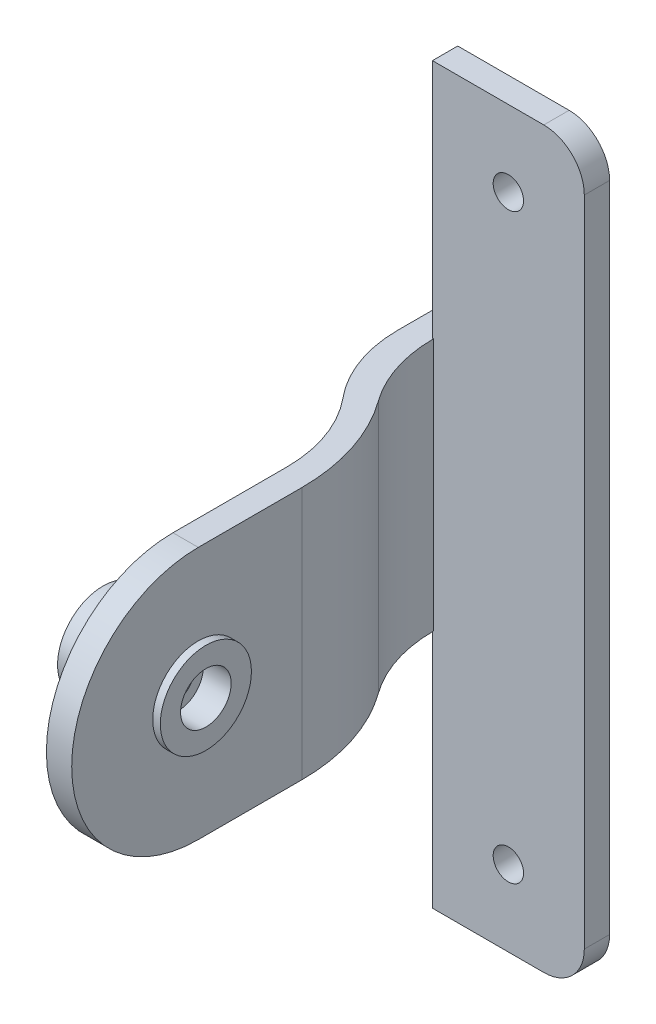
ISO-10303-21;
HEADER;
FILE_DESCRIPTION(('STEP AP214'),'2;1');
FILE_NAME('part.step','',(''),(''),'','','');
FILE_SCHEMA(('AUTOMOTIVE_DESIGN { 1 0 10303 214 1 1 1 1 }'));
ENDSEC;
DATA;
#1=APPLICATION_CONTEXT('core data for automotive mechanical design processes');
#2=APPLICATION_PROTOCOL_DEFINITION('international standard','automotive_design',2000,#1);
#3=PRODUCT_CONTEXT('',#1,'mechanical');
#4=PRODUCT('Part','Part','',(#3));
#5=PRODUCT_RELATED_PRODUCT_CATEGORY('part','',(#4));
#6=PRODUCT_DEFINITION_FORMATION('','',#4);
#7=PRODUCT_DEFINITION_CONTEXT('part definition',#1,'design');
#8=PRODUCT_DEFINITION('design','',#6,#7);
#9=PRODUCT_DEFINITION_SHAPE('','',#8);
#10=(LENGTH_UNIT() NAMED_UNIT(*) SI_UNIT(.MILLI.,.METRE.));
#11=(NAMED_UNIT(*) PLANE_ANGLE_UNIT() SI_UNIT($,.RADIAN.));
#12=(NAMED_UNIT(*) SI_UNIT($,.STERADIAN.) SOLID_ANGLE_UNIT());
#13=UNCERTAINTY_MEASURE_WITH_UNIT(LENGTH_MEASURE(1.E-05),#10,'distance_accuracy_value','');
#14=(GEOMETRIC_REPRESENTATION_CONTEXT(3) GLOBAL_UNCERTAINTY_ASSIGNED_CONTEXT((#13)) GLOBAL_UNIT_ASSIGNED_CONTEXT((#10,
#11,#12)) REPRESENTATION_CONTEXT('',''));
#15=CARTESIAN_POINT('',(0.,0.,0.));
#16=DIRECTION('',(0.,0.,1.));
#17=DIRECTION('',(1.,0.,0.));
#18=AXIS2_PLACEMENT_3D('',#15,#16,#17);
#19=CARTESIAN_POINT('',(-16.5626357879326,-12.5,-10.229605827828));
#20=DIRECTION('',(0.,-1.,0.));
#21=DIRECTION('',(0.,0.,-1.));
#22=AXIS2_PLACEMENT_3D('',#19,#20,#21);
#23=PLANE('',#22);
#24=DIRECTION('',(-1.,0.,0.));
#25=VECTOR('',#24,1.);
#26=CARTESIAN_POINT('',(-6.22117269606802,-12.5,-31.95));
#27=LINE('',#26,#25);
#28=CARTESIAN_POINT('',(-3.82117269606802,-12.5,-31.95));
#29=VERTEX_POINT('',#28);
#30=CARTESIAN_POINT('',(-6.22117269606802,-12.5,-31.95));
#31=VERTEX_POINT('',#30);
#32=EDGE_CURVE('E12',#29,#31,#27,.T.);
#33=ORIENTED_EDGE('',*,*,#32,.F.);
#34=DIRECTION('',(0.,0.,-1.));
#35=VECTOR('',#34,1.);
#36=CARTESIAN_POINT('',(-3.82117269606802,-12.5,-29.45));
#37=LINE('',#36,#35);
#38=CARTESIAN_POINT('',(-3.82117269606802,-12.5,-29.45));
#39=VERTEX_POINT('',#38);
#40=EDGE_CURVE('E220',#39,#29,#37,.T.);
#41=ORIENTED_EDGE('',*,*,#40,.F.);
#42=DIRECTION('',(-1.,0.,0.));
#43=VECTOR('',#42,1.);
#44=CARTESIAN_POINT('',(11.178827303932,-12.5,-29.45));
#45=LINE('',#44,#43);
#46=CARTESIAN_POINT('',(-3.72117269606802,-12.5,-29.45));
#47=VERTEX_POINT('',#46);
#48=EDGE_CURVE('E193',#47,#39,#45,.T.);
#49=ORIENTED_EDGE('',*,*,#48,.F.);
#50=CARTESIAN_POINT('',(10.0176070839933,-12.5,-29.45));
#51=DIRECTION('',(0.,-1.,0.));
#52=DIRECTION('',(0.,0.,1.));
#53=AXIS2_PLACEMENT_3D('',#50,#51,#52);
#54=CIRCLE('',#53,13.7387797800613);
#55=CARTESIAN_POINT('',(-1.1154521756278,-12.5,-21.3995924720058));
#56=VERTEX_POINT('',#55);
#57=EDGE_CURVE('E320',#56,#47,#54,.T.);
#58=ORIENTED_EDGE('',*,*,#57,.F.);
#59=CARTESIAN_POINT('',(-16.5626357879326,-12.5,-10.229605827828));
#60=DIRECTION('',(0.,1.,0.));
#61=DIRECTION('',(0.,0.,-1.));
#62=AXIS2_PLACEMENT_3D('',#59,#60,#61);
#63=CIRCLE('',#62,19.0626357879326);
#64=CARTESIAN_POINT('',(2.5,-12.5,-10.229605827828));
#65=VERTEX_POINT('',#64);
#66=EDGE_CURVE('E317',#65,#56,#63,.T.);
#67=ORIENTED_EDGE('',*,*,#66,.F.);
#68=DIRECTION('',(0.,0.,-1.));
#69=VECTOR('',#68,1.);
#70=CARTESIAN_POINT('',(2.5,-12.5,-7.72960582782795));
#71=LINE('',#70,#69);
#72=CARTESIAN_POINT('',(2.5,-12.5,0.));
#73=VERTEX_POINT('',#72);
#74=EDGE_CURVE('E282',#73,#65,#71,.T.);
#75=ORIENTED_EDGE('',*,*,#74,.F.);
#76=DIRECTION('',(-1.,0.,0.));
#77=VECTOR('',#76,1.);
#78=CARTESIAN_POINT('',(2.5,-12.5,0.));
#79=LINE('',#78,#77);
#80=CARTESIAN_POINT('',(0.,-12.5,0.));
#81=VERTEX_POINT('',#80);
#82=EDGE_CURVE('E252',#73,#81,#79,.T.);
#83=ORIENTED_EDGE('',*,*,#82,.T.);
#84=DIRECTION('',(0.,0.,1.));
#85=VECTOR('',#84,1.);
#86=CARTESIAN_POINT('',(0.,-12.5,-11.229605827828));
#87=LINE('',#86,#85);
#88=CARTESIAN_POINT('',(0.,-12.5,-11.229605827828));
#89=VERTEX_POINT('',#88);
#90=EDGE_CURVE('E293',#89,#81,#87,.T.);
#91=ORIENTED_EDGE('',*,*,#90,.F.);
#92=CARTESIAN_POINT('',(-13.6359802036032,-12.5,-11.229605827828));
#93=DIRECTION('',(0.,-1.,0.));
#94=DIRECTION('',(0.,0.,-1.));
#95=AXIS2_PLACEMENT_3D('',#92,#93,#94);
#96=CIRCLE('',#95,13.6359802036032);
#97=CARTESIAN_POINT('',(-3.1484631025778,-12.5,-19.9446469160133));
#98=VERTEX_POINT('',#97);
#99=EDGE_CURVE('E330',#98,#89,#96,.T.);
#100=ORIENTED_EDGE('',*,*,#99,.F.);
#101=CARTESIAN_POINT('',(7.08671938434082,-12.5,-28.45));
#102=DIRECTION('',(0.,1.,0.));
#103=DIRECTION('',(0.,0.,-1.));
#104=AXIS2_PLACEMENT_3D('',#101,#102,#103);
#105=CIRCLE('',#104,13.3078920804088);
#106=CARTESIAN_POINT('',(-6.22117269606802,-12.5,-28.45));
#107=VERTEX_POINT('',#106);
#108=EDGE_CURVE('E327',#107,#98,#105,.T.);
#109=ORIENTED_EDGE('',*,*,#108,.F.);
#110=DIRECTION('',(0.,0.,1.));
#111=VECTOR('',#110,1.);
#112=CARTESIAN_POINT('',(-6.22117269606802,-12.5,-31.95));
#113=LINE('',#112,#111);
#114=EDGE_CURVE('E323',#31,#107,#113,.T.);
#115=ORIENTED_EDGE('',*,*,#114,.F.);
#116=EDGE_LOOP('',(#33,#41,#49,#58,#67,#75,#83,#91,#100,#109,#115));
#117=FACE_BOUND('',#116,.T.);
#118=ADVANCED_FACE('F45',(#117),#23,.T.);
#119=CARTESIAN_POINT('',(2.5,12.5,-7.72960582782795));
#120=DIRECTION('',(-1.,0.,0.));
#121=DIRECTION('',(0.,0.,1.));
#122=AXIS2_PLACEMENT_3D('',#119,#120,#121);
#123=PLANE('',#122);
#124=ORIENTED_EDGE('',*,*,#74,.T.);
#125=DIRECTION('',(0.,-1.,0.));
#126=VECTOR('',#125,1.);
#127=CARTESIAN_POINT('',(2.5,12.5,-10.229605827828));
#128=LINE('',#127,#126);
#129=CARTESIAN_POINT('',(2.5,12.5,-10.229605827828));
#130=VERTEX_POINT('',#129);
#131=EDGE_CURVE('E49',#130,#65,#128,.T.);
#132=ORIENTED_EDGE('',*,*,#131,.F.);
#133=DIRECTION('',(0.,0.,-1.));
#134=VECTOR('',#133,1.);
#135=CARTESIAN_POINT('',(2.5,12.5,-7.72960582782795));
#136=LINE('',#135,#134);
#137=CARTESIAN_POINT('',(2.5,12.5,0.));
#138=VERTEX_POINT('',#137);
#139=EDGE_CURVE('E289',#138,#130,#136,.T.);
#140=ORIENTED_EDGE('',*,*,#139,.F.);
#141=CARTESIAN_POINT('',(2.5,0.,0.));
#142=DIRECTION('',(1.,0.,0.));
#143=DIRECTION('',(0.,0.,-1.));
#144=AXIS2_PLACEMENT_3D('',#141,#142,#143);
#145=CIRCLE('',#144,12.5);
#146=EDGE_CURVE('E240',#138,#73,#145,.T.);
#147=ORIENTED_EDGE('',*,*,#146,.T.);
#148=EDGE_LOOP('',(#124,#132,#140,#147));
#149=FACE_BOUND('',#148,.T.);
#150=CARTESIAN_POINT('',(2.5,0.,0.));
#151=DIRECTION('',(1.,0.,0.));
#152=DIRECTION('',(0.,0.,-1.));
#153=AXIS2_PLACEMENT_3D('',#150,#151,#152);
#154=CIRCLE('',#153,4.5);
#155=CARTESIAN_POINT('',(2.5,0.,-4.5));
#156=VERTEX_POINT('',#155);
#157=EDGE_CURVE('E278',#156,#156,#154,.T.);
#158=ORIENTED_EDGE('',*,*,#157,.F.);
#159=EDGE_LOOP('',(#158));
#160=FACE_BOUND('',#159,.T.);
#161=ADVANCED_FACE('F47',(#149,#160),#123,.F.);
#162=CARTESIAN_POINT('',(-16.5626357879326,12.5,-10.229605827828));
#163=DIRECTION('',(0.,-1.,0.));
#164=DIRECTION('',(0.,0.,-1.));
#165=AXIS2_PLACEMENT_3D('',#162,#163,#164);
#166=CYLINDRICAL_SURFACE('',#165,19.0626357879326);
#167=ORIENTED_EDGE('',*,*,#66,.T.);
#168=DIRECTION('',(0.,-1.,0.));
#169=VECTOR('',#168,1.);
#170=CARTESIAN_POINT('',(-1.1154521756278,12.5,-21.3995924720058));
#171=LINE('',#170,#169);
#172=CARTESIAN_POINT('',(-1.1154521756278,12.5,-21.3995924720058));
#173=VERTEX_POINT('',#172);
#174=EDGE_CURVE('E353',#173,#56,#171,.T.);
#175=ORIENTED_EDGE('',*,*,#174,.F.);
#176=CARTESIAN_POINT('',(-16.5626357879326,12.5,-10.229605827828));
#177=DIRECTION('',(0.,1.,0.));
#178=DIRECTION('',(0.,0.,-1.));
#179=AXIS2_PLACEMENT_3D('',#176,#177,#178);
#180=CIRCLE('',#179,19.0626357879326);
#181=EDGE_CURVE('E292',#130,#173,#180,.T.);
#182=ORIENTED_EDGE('',*,*,#181,.F.);
#183=ORIENTED_EDGE('',*,*,#131,.T.);
#184=EDGE_LOOP('',(#167,#175,#182,#183));
#185=FACE_BOUND('',#184,.T.);
#186=ADVANCED_FACE('F365',(#185),#166,.T.);
#187=CARTESIAN_POINT('',(10.0176070839933,12.5,-29.45));
#188=DIRECTION('',(0.,-1.,0.));
#189=DIRECTION('',(0.,0.,-1.));
#190=AXIS2_PLACEMENT_3D('',#187,#188,#189);
#191=CYLINDRICAL_SURFACE('',#190,13.7387797800613);
#192=ORIENTED_EDGE('',*,*,#57,.T.);
#193=DIRECTION('',(0.,-1.,0.));
#194=VECTOR('',#193,1.);
#195=CARTESIAN_POINT('',(-3.72117269606802,12.5,-29.45));
#196=LINE('',#195,#194);
#197=CARTESIAN_POINT('',(-3.72117269606802,12.5,-29.45));
#198=VERTEX_POINT('',#197);
#199=EDGE_CURVE('E350',#198,#47,#196,.T.);
#200=ORIENTED_EDGE('',*,*,#199,.F.);
#201=CARTESIAN_POINT('',(10.0176070839933,12.5,-29.45));
#202=DIRECTION('',(0.,-1.,0.));
#203=DIRECTION('',(0.,0.,1.));
#204=AXIS2_PLACEMENT_3D('',#201,#202,#203);
#205=CIRCLE('',#204,13.7387797800613);
#206=EDGE_CURVE('E296',#173,#198,#205,.T.);
#207=ORIENTED_EDGE('',*,*,#206,.F.);
#208=ORIENTED_EDGE('',*,*,#174,.T.);
#209=EDGE_LOOP('',(#192,#200,#207,#208));
#210=FACE_BOUND('',#209,.T.);
#211=ADVANCED_FACE('F376',(#210),#191,.F.);
#212=CARTESIAN_POINT('',(-6.22117269606802,12.5,-31.95));
#213=DIRECTION('',(0.,0.,1.));
#214=DIRECTION('',(1.,0.,0.));
#215=AXIS2_PLACEMENT_3D('',#212,#213,#214);
#216=PLANE('',#215);
#217=CARTESIAN_POINT('',(3.67882730393198,-28.75,-31.95));
#218=DIRECTION('',(0.,0.,1.));
#219=DIRECTION('',(-1.,0.,0.));
#220=AXIS2_PLACEMENT_3D('',#217,#218,#219);
#221=CIRCLE('',#220,1.5);
#222=CARTESIAN_POINT('',(2.17882730393198,-28.75,-31.95));
#223=VERTEX_POINT('',#222);
#224=EDGE_CURVE('E449',#223,#223,#221,.T.);
#225=ORIENTED_EDGE('',*,*,#224,.T.);
#226=EDGE_LOOP('',(#225));
#227=FACE_BOUND('',#226,.T.);
#228=CARTESIAN_POINT('',(3.67882730393198,28.75,-31.95));
#229=DIRECTION('',(0.,0.,-1.));
#230=DIRECTION('',(-1.,0.,0.));
#231=AXIS2_PLACEMENT_3D('',#228,#229,#230);
#232=CIRCLE('',#231,1.5);
#233=CARTESIAN_POINT('',(2.17882730393198,28.75,-31.95));
#234=VERTEX_POINT('',#233);
#235=EDGE_CURVE('E440',#234,#234,#232,.T.);
#236=ORIENTED_EDGE('',*,*,#235,.F.);
#237=EDGE_LOOP('',(#236));
#238=FACE_BOUND('',#237,.T.);
#239=DIRECTION('',(0.,-1.,0.));
#240=VECTOR('',#239,1.);
#241=CARTESIAN_POINT('',(11.178827303932,12.5,-31.95));
#242=LINE('',#241,#240);
#243=CARTESIAN_POINT('',(11.178827303932,32.25,-31.95));
#244=VERTEX_POINT('',#243);
#245=CARTESIAN_POINT('',(11.178827303932,-32.25,-31.95));
#246=VERTEX_POINT('',#245);
#247=EDGE_CURVE('E174',#244,#246,#242,.T.);
#248=ORIENTED_EDGE('',*,*,#247,.T.);
#249=CARTESIAN_POINT('',(7.17882730393198,-32.25,-31.95));
#250=DIRECTION('',(0.,0.,1.));
#251=DIRECTION('',(-1.,0.,0.));
#252=AXIS2_PLACEMENT_3D('',#249,#250,#251);
#253=CIRCLE('',#252,3.99999999999999);
#254=CARTESIAN_POINT('',(7.17882730393199,-36.25,-31.95));
#255=VERTEX_POINT('',#254);
#256=EDGE_CURVE('E190',#255,#246,#253,.T.);
#257=ORIENTED_EDGE('',*,*,#256,.F.);
#258=DIRECTION('',(1.,0.,0.));
#259=VECTOR('',#258,1.);
#260=CARTESIAN_POINT('',(-3.82117269606801,-36.25,-31.95));
#261=LINE('',#260,#259);
#262=CARTESIAN_POINT('',(-3.82117269606801,-36.25,-31.95));
#263=VERTEX_POINT('',#262);
#264=EDGE_CURVE('E417',#263,#255,#261,.T.);
#265=ORIENTED_EDGE('',*,*,#264,.F.);
#266=DIRECTION('',(0.,-1.,0.));
#267=VECTOR('',#266,1.);
#268=CARTESIAN_POINT('',(-3.82117269606802,-12.5,-31.95));
#269=LINE('',#268,#267);
#270=EDGE_CURVE('E185',#29,#263,#269,.T.);
#271=ORIENTED_EDGE('',*,*,#270,.F.);
#272=ORIENTED_EDGE('',*,*,#32,.T.);
#273=DIRECTION('',(0.,-1.,0.));
#274=VECTOR('',#273,1.);
#275=CARTESIAN_POINT('',(-6.22117269606802,12.5,-31.95));
#276=LINE('',#275,#274);
#277=CARTESIAN_POINT('',(-6.22117269606802,12.5,-31.95));
#278=VERTEX_POINT('',#277);
#279=EDGE_CURVE('E346',#278,#31,#276,.T.);
#280=ORIENTED_EDGE('',*,*,#279,.F.);
#281=DIRECTION('',(-1.,0.,0.));
#282=VECTOR('',#281,1.);
#283=CARTESIAN_POINT('',(-6.22117269606802,12.5,-31.95));
#284=LINE('',#283,#282);
#285=CARTESIAN_POINT('',(-3.82117269606802,12.5,-31.95));
#286=VERTEX_POINT('',#285);
#287=EDGE_CURVE('E299',#286,#278,#284,.T.);
#288=ORIENTED_EDGE('',*,*,#287,.F.);
#289=DIRECTION('',(0.,1.,0.));
#290=VECTOR('',#289,1.);
#291=CARTESIAN_POINT('',(-3.82117269606801,28.75,-31.95));
#292=LINE('',#291,#290);
#293=CARTESIAN_POINT('',(-3.82117269606801,36.25,-31.95));
#294=VERTEX_POINT('',#293);
#295=EDGE_CURVE('E215',#286,#294,#292,.T.);
#296=ORIENTED_EDGE('',*,*,#295,.T.);
#297=DIRECTION('',(1.,0.,0.));
#298=VECTOR('',#297,1.);
#299=CARTESIAN_POINT('',(3.67882730393198,36.25,-31.95));
#300=LINE('',#299,#298);
#301=CARTESIAN_POINT('',(7.17882730393199,36.25,-31.95));
#302=VERTEX_POINT('',#301);
#303=EDGE_CURVE('E219',#294,#302,#300,.T.);
#304=ORIENTED_EDGE('',*,*,#303,.T.);
#305=CARTESIAN_POINT('',(7.17882730393198,32.25,-31.95));
#306=DIRECTION('',(0.,0.,-1.));
#307=DIRECTION('',(-1.,0.,0.));
#308=AXIS2_PLACEMENT_3D('',#305,#306,#307);
#309=CIRCLE('',#308,3.99999999999999);
#310=EDGE_CURVE('E206',#302,#244,#309,.T.);
#311=ORIENTED_EDGE('',*,*,#310,.T.);
#312=EDGE_LOOP('',(#248,#257,#265,#271,#272,#280,#288,#296,#304,#311));
#313=FACE_BOUND('',#312,.T.);
#314=ADVANCED_FACE('F389',(#227,#238,#313),#216,.F.);
#315=CARTESIAN_POINT('',(-6.22117269606802,12.5,-31.95));
#316=DIRECTION('',(1.,0.,0.));
#317=DIRECTION('',(0.,0.,-1.));
#318=AXIS2_PLACEMENT_3D('',#315,#316,#317);
#319=PLANE('',#318);
#320=ORIENTED_EDGE('',*,*,#114,.T.);
#321=DIRECTION('',(0.,-1.,0.));
#322=VECTOR('',#321,1.);
#323=CARTESIAN_POINT('',(-6.22117269606802,12.5,-28.45));
#324=LINE('',#323,#322);
#325=CARTESIAN_POINT('',(-6.22117269606802,12.5,-28.45));
#326=VERTEX_POINT('',#325);
#327=EDGE_CURVE('E342',#326,#107,#324,.T.);
#328=ORIENTED_EDGE('',*,*,#327,.F.);
#329=DIRECTION('',(0.,0.,1.));
#330=VECTOR('',#329,1.);
#331=CARTESIAN_POINT('',(-6.22117269606802,12.5,-31.95));
#332=LINE('',#331,#330);
#333=EDGE_CURVE('E302',#278,#326,#332,.T.);
#334=ORIENTED_EDGE('',*,*,#333,.F.);
#335=ORIENTED_EDGE('',*,*,#279,.T.);
#336=EDGE_LOOP('',(#320,#328,#334,#335));
#337=FACE_BOUND('',#336,.T.);
#338=ADVANCED_FACE('F397',(#337),#319,.F.);
#339=CARTESIAN_POINT('',(7.08671938434082,12.5,-28.45));
#340=DIRECTION('',(0.,-1.,0.));
#341=DIRECTION('',(0.,0.,-1.));
#342=AXIS2_PLACEMENT_3D('',#339,#340,#341);
#343=CYLINDRICAL_SURFACE('',#342,13.3078920804088);
#344=ORIENTED_EDGE('',*,*,#108,.T.);
#345=DIRECTION('',(0.,-1.,0.));
#346=VECTOR('',#345,1.);
#347=CARTESIAN_POINT('',(-3.1484631025778,12.5,-19.9446469160133));
#348=LINE('',#347,#346);
#349=CARTESIAN_POINT('',(-3.1484631025778,12.5,-19.9446469160133));
#350=VERTEX_POINT('',#349);
#351=EDGE_CURVE('E338',#350,#98,#348,.T.);
#352=ORIENTED_EDGE('',*,*,#351,.F.);
#353=CARTESIAN_POINT('',(7.08671938434082,12.5,-28.45));
#354=DIRECTION('',(0.,1.,0.));
#355=DIRECTION('',(0.,0.,-1.));
#356=AXIS2_PLACEMENT_3D('',#353,#354,#355);
#357=CIRCLE('',#356,13.3078920804088);
#358=EDGE_CURVE('E305',#326,#350,#357,.T.);
#359=ORIENTED_EDGE('',*,*,#358,.F.);
#360=ORIENTED_EDGE('',*,*,#327,.T.);
#361=EDGE_LOOP('',(#344,#352,#359,#360));
#362=FACE_BOUND('',#361,.T.);
#363=ADVANCED_FACE('F401',(#362),#343,.T.);
#364=CARTESIAN_POINT('',(-13.6359802036032,12.5,-11.229605827828));
#365=DIRECTION('',(0.,-1.,0.));
#366=DIRECTION('',(0.,0.,-1.));
#367=AXIS2_PLACEMENT_3D('',#364,#365,#366);
#368=CYLINDRICAL_SURFACE('',#367,13.6359802036032);
#369=ORIENTED_EDGE('',*,*,#99,.T.);
#370=DIRECTION('',(0.,-1.,0.));
#371=VECTOR('',#370,1.);
#372=CARTESIAN_POINT('',(0.,12.5,-11.229605827828));
#373=LINE('',#372,#371);
#374=CARTESIAN_POINT('',(0.,12.5,-11.229605827828));
#375=VERTEX_POINT('',#374);
#376=EDGE_CURVE('E314',#375,#89,#373,.T.);
#377=ORIENTED_EDGE('',*,*,#376,.F.);
#378=CARTESIAN_POINT('',(-13.6359802036032,12.5,-11.229605827828));
#379=DIRECTION('',(0.,-1.,0.));
#380=DIRECTION('',(0.,0.,-1.));
#381=AXIS2_PLACEMENT_3D('',#378,#379,#380);
#382=CIRCLE('',#381,13.6359802036032);
#383=EDGE_CURVE('E308',#350,#375,#382,.T.);
#384=ORIENTED_EDGE('',*,*,#383,.F.);
#385=ORIENTED_EDGE('',*,*,#351,.T.);
#386=EDGE_LOOP('',(#369,#377,#384,#385));
#387=FACE_BOUND('',#386,.T.);
#388=ADVANCED_FACE('F406',(#387),#368,.F.);
#389=CARTESIAN_POINT('',(0.,12.5,-11.229605827828));
#390=DIRECTION('',(1.,0.,0.));
#391=DIRECTION('',(0.,0.,-1.));
#392=AXIS2_PLACEMENT_3D('',#389,#390,#391);
#393=PLANE('',#392);
#394=CARTESIAN_POINT('',(0.,0.,0.));
#395=DIRECTION('',(1.,0.,0.));
#396=DIRECTION('',(0.,0.,-1.));
#397=AXIS2_PLACEMENT_3D('',#394,#395,#396);
#398=CIRCLE('',#397,12.5);
#399=CARTESIAN_POINT('',(0.,12.5,0.));
#400=VERTEX_POINT('',#399);
#401=EDGE_CURVE('E245',#400,#81,#398,.T.);
#402=ORIENTED_EDGE('',*,*,#401,.F.);
#403=DIRECTION('',(0.,0.,1.));
#404=VECTOR('',#403,1.);
#405=CARTESIAN_POINT('',(0.,12.5,-11.229605827828));
#406=LINE('',#405,#404);
#407=EDGE_CURVE('E311',#375,#400,#406,.T.);
#408=ORIENTED_EDGE('',*,*,#407,.F.);
#409=ORIENTED_EDGE('',*,*,#376,.T.);
#410=ORIENTED_EDGE('',*,*,#90,.T.);
#411=EDGE_LOOP('',(#402,#408,#409,#410));
#412=FACE_BOUND('',#411,.T.);
#413=CARTESIAN_POINT('',(0.,0.,0.));
#414=DIRECTION('',(1.,0.,0.));
#415=DIRECTION('',(0.,0.,-1.));
#416=AXIS2_PLACEMENT_3D('',#413,#414,#415);
#417=CIRCLE('',#416,4.5);
#418=CARTESIAN_POINT('',(0.,0.,-4.5));
#419=VERTEX_POINT('',#418);
#420=EDGE_CURVE('E247',#419,#419,#417,.T.);
#421=ORIENTED_EDGE('',*,*,#420,.T.);
#422=EDGE_LOOP('',(#421));
#423=FACE_BOUND('',#422,.T.);
#424=ADVANCED_FACE('F412',(#412,#423),#393,.F.);
#425=CARTESIAN_POINT('',(-16.5626357879326,12.5,-10.229605827828));
#426=DIRECTION('',(0.,-1.,0.));
#427=DIRECTION('',(0.,0.,-1.));
#428=AXIS2_PLACEMENT_3D('',#425,#426,#427);
#429=PLANE('',#428);
#430=DIRECTION('',(-1.,0.,0.));
#431=VECTOR('',#430,1.);
#432=CARTESIAN_POINT('',(11.178827303932,12.5,-29.45));
#433=LINE('',#432,#431);
#434=CARTESIAN_POINT('',(-3.82117269606802,12.5,-29.45));
#435=VERTEX_POINT('',#434);
#436=EDGE_CURVE('E62',#198,#435,#433,.T.);
#437=ORIENTED_EDGE('',*,*,#436,.T.);
#438=DIRECTION('',(0.,0.,-1.));
#439=VECTOR('',#438,1.);
#440=CARTESIAN_POINT('',(-3.82117269606802,12.5,-29.45));
#441=LINE('',#440,#439);
#442=EDGE_CURVE('E66',#435,#286,#441,.T.);
#443=ORIENTED_EDGE('',*,*,#442,.T.);
#444=ORIENTED_EDGE('',*,*,#287,.T.);
#445=ORIENTED_EDGE('',*,*,#333,.T.);
#446=ORIENTED_EDGE('',*,*,#358,.T.);
#447=ORIENTED_EDGE('',*,*,#383,.T.);
#448=ORIENTED_EDGE('',*,*,#407,.T.);
#449=DIRECTION('',(-1.,0.,0.));
#450=VECTOR('',#449,1.);
#451=CARTESIAN_POINT('',(2.5,12.5,0.));
#452=LINE('',#451,#450);
#453=EDGE_CURVE('E256',#138,#400,#452,.T.);
#454=ORIENTED_EDGE('',*,*,#453,.F.);
#455=ORIENTED_EDGE('',*,*,#139,.T.);
#456=ORIENTED_EDGE('',*,*,#181,.T.);
#457=ORIENTED_EDGE('',*,*,#206,.T.);
#458=EDGE_LOOP('',(#437,#443,#444,#445,#446,#447,#448,#454,#455,#456,#457));
#459=FACE_BOUND('',#458,.T.);
#460=ADVANCED_FACE('F392',(#459),#429,.F.);
#461=CARTESIAN_POINT('',(2.5,0.,0.));
#462=DIRECTION('',(-1.,0.,0.));
#463=DIRECTION('',(0.,0.,1.));
#464=AXIS2_PLACEMENT_3D('',#461,#462,#463);
#465=CYLINDRICAL_SURFACE('',#464,1.5);
#466=CARTESIAN_POINT('',(-6.9,0.,0.));
#467=DIRECTION('',(-1.,0.,0.));
#468=DIRECTION('',(0.,0.,1.));
#469=AXIS2_PLACEMENT_3D('',#466,#467,#468);
#470=CIRCLE('',#469,1.5);
#471=CARTESIAN_POINT('',(-6.9,0.,1.5));
#472=VERTEX_POINT('',#471);
#473=EDGE_CURVE('E246',#472,#472,#470,.T.);
#474=ORIENTED_EDGE('',*,*,#473,.T.);
#475=EDGE_LOOP('',(#474));
#476=FACE_BOUND('',#475,.T.);
#477=CARTESIAN_POINT('',(0.5,0.,0.));
#478=DIRECTION('',(1.,0.,0.));
#479=DIRECTION('',(0.,0.,-1.));
#480=AXIS2_PLACEMENT_3D('',#477,#478,#479);
#481=CIRCLE('',#480,1.5);
#482=CARTESIAN_POINT('',(0.5,0.,-1.5));
#483=VERTEX_POINT('',#482);
#484=EDGE_CURVE('E241',#483,#483,#481,.T.);
#485=ORIENTED_EDGE('',*,*,#484,.T.);
#486=EDGE_LOOP('',(#485));
#487=FACE_BOUND('',#486,.T.);
#488=ADVANCED_FACE('F531',(#476,#487),#465,.F.);
#489=CARTESIAN_POINT('',(2.5,0.,0.));
#490=DIRECTION('',(-1.,0.,0.));
#491=DIRECTION('',(0.,0.,1.));
#492=AXIS2_PLACEMENT_3D('',#489,#490,#491);
#493=CYLINDRICAL_SURFACE('',#492,12.5);
#494=ORIENTED_EDGE('',*,*,#401,.T.);
#495=ORIENTED_EDGE('',*,*,#82,.F.);
#496=ORIENTED_EDGE('',*,*,#146,.F.);
#497=ORIENTED_EDGE('',*,*,#453,.T.);
#498=EDGE_LOOP('',(#494,#495,#496,#497));
#499=FACE_BOUND('',#498,.T.);
#500=ADVANCED_FACE('F411',(#499),#493,.T.);
#501=CARTESIAN_POINT('',(15.2279220613579,0.,0.));
#502=DIRECTION('',(-1.,0.,0.));
#503=DIRECTION('',(0.,0.,1.));
#504=AXIS2_PLACEMENT_3D('',#501,#502,#503);
#505=CYLINDRICAL_SURFACE('',#504,4.5);
#506=CARTESIAN_POINT('',(-6.9,0.,0.));
#507=DIRECTION('',(-1.,0.,0.));
#508=DIRECTION('',(0.,0.,1.));
#509=AXIS2_PLACEMENT_3D('',#506,#507,#508);
#510=CIRCLE('',#509,4.5);
#511=CARTESIAN_POINT('',(-6.9,0.,4.5));
#512=VERTEX_POINT('',#511);
#513=EDGE_CURVE('E251',#512,#512,#510,.T.);
#514=ORIENTED_EDGE('',*,*,#513,.F.);
#515=EDGE_LOOP('',(#514));
#516=FACE_BOUND('',#515,.T.);
#517=ORIENTED_EDGE('',*,*,#420,.F.);
#518=EDGE_LOOP('',(#517));
#519=FACE_BOUND('',#518,.T.);
#520=ADVANCED_FACE('F548',(#516,#519),#505,.T.);
#521=CARTESIAN_POINT('',(-6.9,0.,0.));
#522=DIRECTION('',(-1.,0.,0.));
#523=DIRECTION('',(0.,0.,1.));
#524=AXIS2_PLACEMENT_3D('',#521,#522,#523);
#525=PLANE('',#524);
#526=ORIENTED_EDGE('',*,*,#513,.T.);
#527=EDGE_LOOP('',(#526));
#528=FACE_BOUND('',#527,.T.);
#529=ORIENTED_EDGE('',*,*,#473,.F.);
#530=EDGE_LOOP('',(#529));
#531=FACE_BOUND('',#530,.T.);
#532=ADVANCED_FACE('F555',(#528,#531),#525,.T.);
#533=CARTESIAN_POINT('',(0.5,0.,0.));
#534=DIRECTION('',(1.,0.,0.));
#535=DIRECTION('',(0.,0.,-1.));
#536=AXIS2_PLACEMENT_3D('',#533,#534,#535);
#537=CYLINDRICAL_SURFACE('',#536,2.5);
#538=CARTESIAN_POINT('',(0.5,0.,0.));
#539=DIRECTION('',(1.,0.,0.));
#540=DIRECTION('',(0.,0.,-1.));
#541=AXIS2_PLACEMENT_3D('',#538,#539,#540);
#542=CIRCLE('',#541,2.5);
#543=CARTESIAN_POINT('',(0.5,0.,-2.5));
#544=VERTEX_POINT('',#543);
#545=EDGE_CURVE('E273',#544,#544,#542,.T.);
#546=ORIENTED_EDGE('',*,*,#545,.F.);
#547=EDGE_LOOP('',(#546));
#548=FACE_BOUND('',#547,.T.);
#549=CARTESIAN_POINT('',(3.25,0.,0.));
#550=DIRECTION('',(1.,0.,0.));
#551=DIRECTION('',(0.,0.,-1.));
#552=AXIS2_PLACEMENT_3D('',#549,#550,#551);
#553=CIRCLE('',#552,2.5);
#554=CARTESIAN_POINT('',(3.25,0.,-2.5));
#555=VERTEX_POINT('',#554);
#556=EDGE_CURVE('E269',#555,#555,#553,.T.);
#557=ORIENTED_EDGE('',*,*,#556,.T.);
#558=EDGE_LOOP('',(#557));
#559=FACE_BOUND('',#558,.T.);
#560=ADVANCED_FACE('F563',(#548,#559),#537,.F.);
#561=CARTESIAN_POINT('',(0.5,0.,0.));
#562=DIRECTION('',(1.,0.,0.));
#563=DIRECTION('',(0.,0.,-1.));
#564=AXIS2_PLACEMENT_3D('',#561,#562,#563);
#565=PLANE('',#564);
#566=ORIENTED_EDGE('',*,*,#484,.F.);
#567=EDGE_LOOP('',(#566));
#568=FACE_BOUND('',#567,.T.);
#569=ORIENTED_EDGE('',*,*,#545,.T.);
#570=EDGE_LOOP('',(#569));
#571=FACE_BOUND('',#570,.T.);
#572=ADVANCED_FACE('F571',(#568,#571),#565,.T.);
#573=CARTESIAN_POINT('',(3.25,0.,0.));
#574=DIRECTION('',(1.,0.,0.));
#575=DIRECTION('',(0.,0.,-1.));
#576=AXIS2_PLACEMENT_3D('',#573,#574,#575);
#577=PLANE('',#576);
#578=CARTESIAN_POINT('',(3.25,0.,0.));
#579=DIRECTION('',(1.,0.,0.));
#580=DIRECTION('',(0.,0.,-1.));
#581=AXIS2_PLACEMENT_3D('',#578,#579,#580);
#582=CIRCLE('',#581,4.5);
#583=CARTESIAN_POINT('',(3.25,0.,-4.5));
#584=VERTEX_POINT('',#583);
#585=EDGE_CURVE('E277',#584,#584,#582,.T.);
#586=ORIENTED_EDGE('',*,*,#585,.T.);
#587=EDGE_LOOP('',(#586));
#588=FACE_BOUND('',#587,.T.);
#589=ORIENTED_EDGE('',*,*,#556,.F.);
#590=EDGE_LOOP('',(#589));
#591=FACE_BOUND('',#590,.T.);
#592=ADVANCED_FACE('F579',(#588,#591),#577,.T.);
#593=CARTESIAN_POINT('',(3.25,0.,0.));
#594=DIRECTION('',(-1.,0.,0.));
#595=DIRECTION('',(0.,0.,1.));
#596=AXIS2_PLACEMENT_3D('',#593,#594,#595);
#597=CYLINDRICAL_SURFACE('',#596,4.5);
#598=ORIENTED_EDGE('',*,*,#585,.F.);
#599=EDGE_LOOP('',(#598));
#600=FACE_BOUND('',#599,.T.);
#601=ORIENTED_EDGE('',*,*,#157,.T.);
#602=EDGE_LOOP('',(#601));
#603=FACE_BOUND('',#602,.T.);
#604=ADVANCED_FACE('F469',(#600,#603),#597,.T.);
#605=CARTESIAN_POINT('',(11.178827303932,12.5,-31.95));
#606=DIRECTION('',(-1.,0.,0.));
#607=DIRECTION('',(0.,0.,1.));
#608=AXIS2_PLACEMENT_3D('',#605,#606,#607);
#609=PLANE('',#608);
#610=DIRECTION('',(0.,-1.,0.));
#611=VECTOR('',#610,1.);
#612=CARTESIAN_POINT('',(11.178827303932,12.5,-29.45));
#613=LINE('',#612,#611);
#614=CARTESIAN_POINT('',(11.178827303932,32.25,-29.45));
#615=VERTEX_POINT('',#614);
#616=CARTESIAN_POINT('',(11.178827303932,-32.25,-29.45));
#617=VERTEX_POINT('',#616);
#618=EDGE_CURVE('E163',#615,#617,#613,.T.);
#619=ORIENTED_EDGE('',*,*,#618,.T.);
#620=DIRECTION('',(0.,0.,-1.));
#621=VECTOR('',#620,1.);
#622=CARTESIAN_POINT('',(11.178827303932,-32.25,-29.45));
#623=LINE('',#622,#621);
#624=EDGE_CURVE('E167',#617,#246,#623,.T.);
#625=ORIENTED_EDGE('',*,*,#624,.T.);
#626=ORIENTED_EDGE('',*,*,#247,.F.);
#627=DIRECTION('',(0.,0.,-1.));
#628=VECTOR('',#627,1.);
#629=CARTESIAN_POINT('',(11.178827303932,32.25,-29.45));
#630=LINE('',#629,#628);
#631=EDGE_CURVE('E169',#615,#244,#630,.T.);
#632=ORIENTED_EDGE('',*,*,#631,.F.);
#633=EDGE_LOOP('',(#619,#625,#626,#632));
#634=FACE_BOUND('',#633,.T.);
#635=ADVANCED_FACE('F165',(#634),#609,.F.);
#636=CARTESIAN_POINT('',(11.178827303932,12.5,-29.45));
#637=DIRECTION('',(0.,0.,-1.));
#638=DIRECTION('',(-1.,0.,0.));
#639=AXIS2_PLACEMENT_3D('',#636,#637,#638);
#640=PLANE('',#639);
#641=CARTESIAN_POINT('',(3.67882730393198,-28.75,-29.45));
#642=DIRECTION('',(0.,0.,1.));
#643=DIRECTION('',(-1.,0.,0.));
#644=AXIS2_PLACEMENT_3D('',#641,#642,#643);
#645=CIRCLE('',#644,1.5);
#646=CARTESIAN_POINT('',(2.17882730393198,-28.75,-29.45));
#647=VERTEX_POINT('',#646);
#648=EDGE_CURVE('E446',#647,#647,#645,.T.);
#649=ORIENTED_EDGE('',*,*,#648,.F.);
#650=EDGE_LOOP('',(#649));
#651=FACE_BOUND('',#650,.T.);
#652=CARTESIAN_POINT('',(3.67882730393198,28.75,-29.45));
#653=DIRECTION('',(0.,0.,-1.));
#654=DIRECTION('',(-1.,0.,0.));
#655=AXIS2_PLACEMENT_3D('',#652,#653,#654);
#656=CIRCLE('',#655,1.5);
#657=CARTESIAN_POINT('',(2.17882730393198,28.75,-29.45));
#658=VERTEX_POINT('',#657);
#659=EDGE_CURVE('E437',#658,#658,#656,.T.);
#660=ORIENTED_EDGE('',*,*,#659,.T.);
#661=EDGE_LOOP('',(#660));
#662=FACE_BOUND('',#661,.T.);
#663=ORIENTED_EDGE('',*,*,#436,.F.);
#664=ORIENTED_EDGE('',*,*,#199,.T.);
#665=ORIENTED_EDGE('',*,*,#48,.T.);
#666=DIRECTION('',(0.,-1.,0.));
#667=VECTOR('',#666,1.);
#668=CARTESIAN_POINT('',(-3.82117269606801,-28.75,-29.45));
#669=LINE('',#668,#667);
#670=CARTESIAN_POINT('',(-3.82117269606801,-36.25,-29.45));
#671=VERTEX_POINT('',#670);
#672=EDGE_CURVE('E199',#39,#671,#669,.T.);
#673=ORIENTED_EDGE('',*,*,#672,.T.);
#674=DIRECTION('',(1.,0.,0.));
#675=VECTOR('',#674,1.);
#676=CARTESIAN_POINT('',(3.67882730393198,-36.25,-29.45));
#677=LINE('',#676,#675);
#678=CARTESIAN_POINT('',(7.17882730393199,-36.25,-29.45));
#679=VERTEX_POINT('',#678);
#680=EDGE_CURVE('E180',#671,#679,#677,.T.);
#681=ORIENTED_EDGE('',*,*,#680,.T.);
#682=CARTESIAN_POINT('',(7.17882730393198,-32.25,-29.45));
#683=DIRECTION('',(0.,0.,1.));
#684=DIRECTION('',(-1.,0.,0.));
#685=AXIS2_PLACEMENT_3D('',#682,#683,#684);
#686=CIRCLE('',#685,3.99999999999999);
#687=EDGE_CURVE('E177',#679,#617,#686,.T.);
#688=ORIENTED_EDGE('',*,*,#687,.T.);
#689=ORIENTED_EDGE('',*,*,#618,.F.);
#690=CARTESIAN_POINT('',(7.17882730393198,32.25,-29.45));
#691=DIRECTION('',(0.,0.,-1.));
#692=DIRECTION('',(-1.,0.,0.));
#693=AXIS2_PLACEMENT_3D('',#690,#691,#692);
#694=CIRCLE('',#693,3.99999999999999);
#695=CARTESIAN_POINT('',(7.17882730393199,36.25,-29.45));
#696=VERTEX_POINT('',#695);
#697=EDGE_CURVE('E212',#696,#615,#694,.T.);
#698=ORIENTED_EDGE('',*,*,#697,.F.);
#699=DIRECTION('',(1.,0.,0.));
#700=VECTOR('',#699,1.);
#701=CARTESIAN_POINT('',(-3.82117269606801,36.25,-29.45));
#702=LINE('',#701,#700);
#703=CARTESIAN_POINT('',(-3.82117269606801,36.25,-29.45));
#704=VERTEX_POINT('',#703);
#705=EDGE_CURVE('E209',#704,#696,#702,.T.);
#706=ORIENTED_EDGE('',*,*,#705,.F.);
#707=DIRECTION('',(0.,1.,0.));
#708=VECTOR('',#707,1.);
#709=CARTESIAN_POINT('',(-3.82117269606802,12.5,-29.45));
#710=LINE('',#709,#708);
#711=EDGE_CURVE('E205',#435,#704,#710,.T.);
#712=ORIENTED_EDGE('',*,*,#711,.F.);
#713=EDGE_LOOP('',(#663,#664,#665,#673,#681,#688,#689,#698,#706,#712));
#714=FACE_BOUND('',#713,.T.);
#715=ADVANCED_FACE('F178',(#651,#662,#714),#640,.F.);
#716=CARTESIAN_POINT('',(7.17882730393198,32.25,-29.45));
#717=DIRECTION('',(0.,0.,-1.));
#718=DIRECTION('',(-1.,0.,0.));
#719=AXIS2_PLACEMENT_3D('',#716,#717,#718);
#720=CYLINDRICAL_SURFACE('',#719,3.99999999999999);
#721=ORIENTED_EDGE('',*,*,#310,.F.);
#722=DIRECTION('',(0.,0.,-1.));
#723=VECTOR('',#722,1.);
#724=CARTESIAN_POINT('',(7.17882730393199,36.25,-29.45));
#725=LINE('',#724,#723);
#726=EDGE_CURVE('E229',#696,#302,#725,.T.);
#727=ORIENTED_EDGE('',*,*,#726,.F.);
#728=ORIENTED_EDGE('',*,*,#697,.T.);
#729=ORIENTED_EDGE('',*,*,#631,.T.);
#730=EDGE_LOOP('',(#721,#727,#728,#729));
#731=FACE_BOUND('',#730,.T.);
#732=ADVANCED_FACE('F461',(#731),#720,.T.);
#733=CARTESIAN_POINT('',(3.67882730393198,36.25,-29.45));
#734=DIRECTION('',(0.,1.,0.));
#735=DIRECTION('',(-1.,0.,0.));
#736=AXIS2_PLACEMENT_3D('',#733,#734,#735);
#737=PLANE('',#736);
#738=ORIENTED_EDGE('',*,*,#303,.F.);
#739=DIRECTION('',(0.,0.,-1.));
#740=VECTOR('',#739,1.);
#741=CARTESIAN_POINT('',(-3.82117269606801,36.25,-29.45));
#742=LINE('',#741,#740);
#743=EDGE_CURVE('E232',#704,#294,#742,.T.);
#744=ORIENTED_EDGE('',*,*,#743,.F.);
#745=ORIENTED_EDGE('',*,*,#705,.T.);
#746=ORIENTED_EDGE('',*,*,#726,.T.);
#747=EDGE_LOOP('',(#738,#744,#745,#746));
#748=FACE_BOUND('',#747,.T.);
#749=ADVANCED_FACE('F385',(#748),#737,.T.);
#750=CARTESIAN_POINT('',(-3.82117269606801,28.75,-29.45));
#751=DIRECTION('',(-1.,0.,0.));
#752=DIRECTION('',(0.,0.,1.));
#753=AXIS2_PLACEMENT_3D('',#750,#751,#752);
#754=PLANE('',#753);
#755=ORIENTED_EDGE('',*,*,#295,.F.);
#756=ORIENTED_EDGE('',*,*,#442,.F.);
#757=ORIENTED_EDGE('',*,*,#711,.T.);
#758=ORIENTED_EDGE('',*,*,#743,.T.);
#759=EDGE_LOOP('',(#755,#756,#757,#758));
#760=FACE_BOUND('',#759,.T.);
#761=ADVANCED_FACE('F383',(#760),#754,.T.);
#762=CARTESIAN_POINT('',(-3.82117269606802,-12.5,-29.45));
#763=DIRECTION('',(1.,0.,0.));
#764=DIRECTION('',(0.,1.,0.));
#765=AXIS2_PLACEMENT_3D('',#762,#763,#764);
#766=PLANE('',#765);
#767=ORIENTED_EDGE('',*,*,#270,.T.);
#768=DIRECTION('',(0.,0.,-1.));
#769=VECTOR('',#768,1.);
#770=CARTESIAN_POINT('',(-3.82117269606801,-36.25,-29.45));
#771=LINE('',#770,#769);
#772=EDGE_CURVE('E197',#671,#263,#771,.T.);
#773=ORIENTED_EDGE('',*,*,#772,.F.);
#774=ORIENTED_EDGE('',*,*,#672,.F.);
#775=ORIENTED_EDGE('',*,*,#40,.T.);
#776=EDGE_LOOP('',(#767,#773,#774,#775));
#777=FACE_BOUND('',#776,.T.);
#778=ADVANCED_FACE('F431',(#777),#766,.F.);
#779=CARTESIAN_POINT('',(-3.82117269606801,-36.25,-29.45));
#780=DIRECTION('',(0.,1.,0.));
#781=DIRECTION('',(0.,0.,1.));
#782=AXIS2_PLACEMENT_3D('',#779,#780,#781);
#783=PLANE('',#782);
#784=ORIENTED_EDGE('',*,*,#264,.T.);
#785=DIRECTION('',(0.,0.,-1.));
#786=VECTOR('',#785,1.);
#787=CARTESIAN_POINT('',(7.17882730393199,-36.25,-29.45));
#788=LINE('',#787,#786);
#789=EDGE_CURVE('E192',#679,#255,#788,.T.);
#790=ORIENTED_EDGE('',*,*,#789,.F.);
#791=ORIENTED_EDGE('',*,*,#680,.F.);
#792=ORIENTED_EDGE('',*,*,#772,.T.);
#793=EDGE_LOOP('',(#784,#790,#791,#792));
#794=FACE_BOUND('',#793,.T.);
#795=ADVANCED_FACE('F430',(#794),#783,.F.);
#796=CARTESIAN_POINT('',(7.17882730393198,-32.25,-29.45));
#797=DIRECTION('',(0.,0.,-1.));
#798=DIRECTION('',(-1.,0.,0.));
#799=AXIS2_PLACEMENT_3D('',#796,#797,#798);
#800=CYLINDRICAL_SURFACE('',#799,3.99999999999999);
#801=ORIENTED_EDGE('',*,*,#256,.T.);
#802=ORIENTED_EDGE('',*,*,#624,.F.);
#803=ORIENTED_EDGE('',*,*,#687,.F.);
#804=ORIENTED_EDGE('',*,*,#789,.T.);
#805=EDGE_LOOP('',(#801,#802,#803,#804));
#806=FACE_BOUND('',#805,.T.);
#807=ADVANCED_FACE('F188',(#806),#800,.T.);
#808=CARTESIAN_POINT('',(3.67882730393198,28.75,-29.45));
#809=DIRECTION('',(0.,0.,-1.));
#810=DIRECTION('',(-1.,0.,0.));
#811=AXIS2_PLACEMENT_3D('',#808,#809,#810);
#812=CYLINDRICAL_SURFACE('',#811,1.5);
#813=ORIENTED_EDGE('',*,*,#659,.F.);
#814=EDGE_LOOP('',(#813));
#815=FACE_BOUND('',#814,.T.);
#816=ORIENTED_EDGE('',*,*,#235,.T.);
#817=EDGE_LOOP('',(#816));
#818=FACE_BOUND('',#817,.T.);
#819=ADVANCED_FACE('F637',(#815,#818),#812,.F.);
#820=CARTESIAN_POINT('',(3.67882730393198,-28.75,-29.45));
#821=DIRECTION('',(0.,0.,-1.));
#822=DIRECTION('',(-1.,0.,0.));
#823=AXIS2_PLACEMENT_3D('',#820,#821,#822);
#824=CYLINDRICAL_SURFACE('',#823,1.5);
#825=ORIENTED_EDGE('',*,*,#648,.T.);
#826=EDGE_LOOP('',(#825));
#827=FACE_BOUND('',#826,.T.);
#828=ORIENTED_EDGE('',*,*,#224,.F.);
#829=EDGE_LOOP('',(#828));
#830=FACE_BOUND('',#829,.T.);
#831=ADVANCED_FACE('F457',(#827,#830),#824,.F.);
#832=CLOSED_SHELL('',(#118,#161,#186,#211,#314,#338,#363,#388,#424,#460,#488,#500,#520,#532,
#560,#572,#592,#604,#635,#715,#732,#749,#761,#778,#795,#807,#819,#831));
#833=MANIFOLD_SOLID_BREP('B2',#832);
#834=ADVANCED_BREP_SHAPE_REPRESENTATION('',(#18,#833),#14);
#835=SHAPE_DEFINITION_REPRESENTATION(#9,#834);
ENDSEC;
END-ISO-10303-21;
